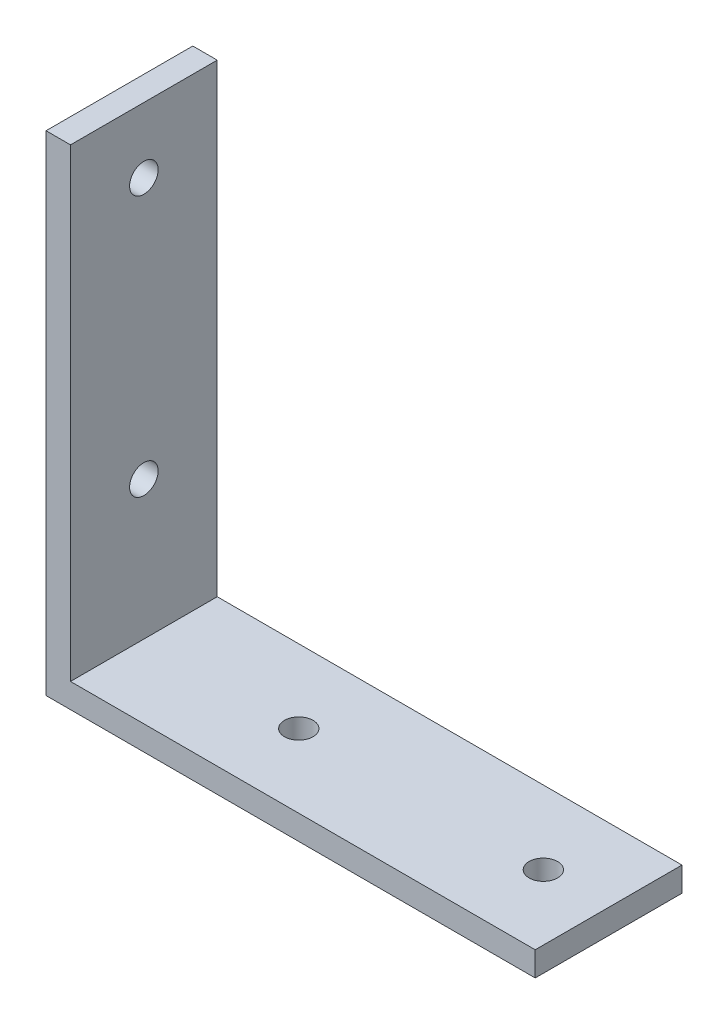
ISO-10303-21;
HEADER;
FILE_DESCRIPTION(('STEP AP214'),'2;1');
FILE_NAME('part.step','',(''),(''),'','','');
FILE_SCHEMA(('AUTOMOTIVE_DESIGN { 1 0 10303 214 1 1 1 1 }'));
ENDSEC;
DATA;
#1=APPLICATION_CONTEXT('core data for automotive mechanical design processes');
#2=APPLICATION_PROTOCOL_DEFINITION('international standard','automotive_design',2000,#1);
#3=PRODUCT_CONTEXT('',#1,'mechanical');
#4=PRODUCT('Part','Part','',(#3));
#5=PRODUCT_RELATED_PRODUCT_CATEGORY('part','',(#4));
#6=PRODUCT_DEFINITION_FORMATION('','',#4);
#7=PRODUCT_DEFINITION_CONTEXT('part definition',#1,'design');
#8=PRODUCT_DEFINITION('design','',#6,#7);
#9=PRODUCT_DEFINITION_SHAPE('','',#8);
#10=(LENGTH_UNIT() NAMED_UNIT(*) SI_UNIT(.MILLI.,.METRE.));
#11=(NAMED_UNIT(*) PLANE_ANGLE_UNIT() SI_UNIT($,.RADIAN.));
#12=(NAMED_UNIT(*) SI_UNIT($,.STERADIAN.) SOLID_ANGLE_UNIT());
#13=UNCERTAINTY_MEASURE_WITH_UNIT(LENGTH_MEASURE(1.E-05),#10,'distance_accuracy_value','');
#14=(GEOMETRIC_REPRESENTATION_CONTEXT(3) GLOBAL_UNCERTAINTY_ASSIGNED_CONTEXT((#13)) GLOBAL_UNIT_ASSIGNED_CONTEXT((#10,
#11,#12)) REPRESENTATION_CONTEXT('',''));
#15=CARTESIAN_POINT('',(0.,0.,0.));
#16=DIRECTION('',(0.,0.,1.));
#17=DIRECTION('',(1.,0.,0.));
#18=AXIS2_PLACEMENT_3D('',#15,#16,#17);
#19=CARTESIAN_POINT('',(0.,60.,18.));
#20=DIRECTION('',(1.,0.,0.));
#21=DIRECTION('',(0.,0.,-1.));
#22=AXIS2_PLACEMENT_3D('',#19,#20,#21);
#23=PLANE('',#22);
#24=CARTESIAN_POINT('',(0.,52.,9.));
#25=DIRECTION('',(1.,0.,0.));
#26=DIRECTION('',(0.,1.,0.));
#27=AXIS2_PLACEMENT_3D('',#24,#25,#26);
#28=CIRCLE('',#27,1.75);
#29=CARTESIAN_POINT('',(0.,53.75,9.));
#30=VERTEX_POINT('',#29);
#31=EDGE_CURVE('E167',#30,#30,#28,.T.);
#32=ORIENTED_EDGE('',*,*,#31,.T.);
#33=EDGE_LOOP('',(#32));
#34=FACE_BOUND('',#33,.T.);
#35=CARTESIAN_POINT('',(0.,20.,9.));
#36=DIRECTION('',(1.,0.,0.));
#37=DIRECTION('',(0.,1.,0.));
#38=AXIS2_PLACEMENT_3D('',#35,#36,#37);
#39=CIRCLE('',#38,1.75);
#40=CARTESIAN_POINT('',(0.,21.75,9.));
#41=VERTEX_POINT('',#40);
#42=EDGE_CURVE('E179',#41,#41,#39,.T.);
#43=ORIENTED_EDGE('',*,*,#42,.T.);
#44=EDGE_LOOP('',(#43));
#45=FACE_BOUND('',#44,.T.);
#46=DIRECTION('',(0.,-1.,0.));
#47=VECTOR('',#46,1.);
#48=CARTESIAN_POINT('',(0.,60.,0.));
#49=LINE('',#48,#47);
#50=CARTESIAN_POINT('',(0.,60.,0.));
#51=VERTEX_POINT('',#50);
#52=CARTESIAN_POINT('',(0.,0.,0.));
#53=VERTEX_POINT('',#52);
#54=EDGE_CURVE('E136',#51,#53,#49,.T.);
#55=ORIENTED_EDGE('',*,*,#54,.T.);
#56=DIRECTION('',(0.,0.,-1.));
#57=VECTOR('',#56,1.);
#58=CARTESIAN_POINT('',(0.,0.,18.));
#59=LINE('',#58,#57);
#60=CARTESIAN_POINT('',(0.,0.,18.));
#61=VERTEX_POINT('',#60);
#62=EDGE_CURVE('E11',#61,#53,#59,.T.);
#63=ORIENTED_EDGE('',*,*,#62,.F.);
#64=DIRECTION('',(0.,-1.,0.));
#65=VECTOR('',#64,1.);
#66=CARTESIAN_POINT('',(0.,60.,18.));
#67=LINE('',#66,#65);
#68=CARTESIAN_POINT('',(0.,60.,18.));
#69=VERTEX_POINT('',#68);
#70=EDGE_CURVE('E153',#69,#61,#67,.T.);
#71=ORIENTED_EDGE('',*,*,#70,.F.);
#72=DIRECTION('',(0.,0.,-1.));
#73=VECTOR('',#72,1.);
#74=CARTESIAN_POINT('',(0.,60.,18.));
#75=LINE('',#74,#73);
#76=EDGE_CURVE('E132',#69,#51,#75,.T.);
#77=ORIENTED_EDGE('',*,*,#76,.T.);
#78=EDGE_LOOP('',(#55,#63,#71,#77));
#79=FACE_BOUND('',#78,.T.);
#80=ADVANCED_FACE('F45',(#34,#45,#79),#23,.F.);
#81=CARTESIAN_POINT('',(0.,0.,18.));
#82=DIRECTION('',(0.,1.,0.));
#83=DIRECTION('',(0.,0.,1.));
#84=AXIS2_PLACEMENT_3D('',#81,#82,#83);
#85=PLANE('',#84);
#86=CARTESIAN_POINT('',(52.,0.,9.00000000000001));
#87=DIRECTION('',(0.,1.,0.));
#88=DIRECTION('',(-1.,0.,0.));
#89=AXIS2_PLACEMENT_3D('',#86,#87,#88);
#90=CIRCLE('',#89,1.75);
#91=CARTESIAN_POINT('',(50.25,0.,9.00000000000001));
#92=VERTEX_POINT('',#91);
#93=EDGE_CURVE('E173',#92,#92,#90,.T.);
#94=ORIENTED_EDGE('',*,*,#93,.T.);
#95=EDGE_LOOP('',(#94));
#96=FACE_BOUND('',#95,.T.);
#97=CARTESIAN_POINT('',(22.,0.,9.00000000000001));
#98=DIRECTION('',(0.,1.,0.));
#99=DIRECTION('',(-1.,0.,0.));
#100=AXIS2_PLACEMENT_3D('',#97,#98,#99);
#101=CIRCLE('',#100,1.75);
#102=CARTESIAN_POINT('',(20.25,0.,9.00000000000001));
#103=VERTEX_POINT('',#102);
#104=EDGE_CURVE('E181',#103,#103,#101,.T.);
#105=ORIENTED_EDGE('',*,*,#104,.T.);
#106=EDGE_LOOP('',(#105));
#107=FACE_BOUND('',#106,.T.);
#108=DIRECTION('',(1.,0.,0.));
#109=VECTOR('',#108,1.);
#110=CARTESIAN_POINT('',(0.,0.,0.));
#111=LINE('',#110,#109);
#112=CARTESIAN_POINT('',(60.,0.,0.));
#113=VERTEX_POINT('',#112);
#114=EDGE_CURVE('E140',#53,#113,#111,.T.);
#115=ORIENTED_EDGE('',*,*,#114,.T.);
#116=DIRECTION('',(0.,0.,-1.));
#117=VECTOR('',#116,1.);
#118=CARTESIAN_POINT('',(60.,0.,18.));
#119=LINE('',#118,#117);
#120=CARTESIAN_POINT('',(60.,0.,18.));
#121=VERTEX_POINT('',#120);
#122=EDGE_CURVE('E55',#121,#113,#119,.T.);
#123=ORIENTED_EDGE('',*,*,#122,.F.);
#124=DIRECTION('',(1.,0.,0.));
#125=VECTOR('',#124,1.);
#126=CARTESIAN_POINT('',(0.,0.,18.));
#127=LINE('',#126,#125);
#128=EDGE_CURVE('E101',#61,#121,#127,.T.);
#129=ORIENTED_EDGE('',*,*,#128,.F.);
#130=ORIENTED_EDGE('',*,*,#62,.T.);
#131=EDGE_LOOP('',(#115,#123,#129,#130));
#132=FACE_BOUND('',#131,.T.);
#133=ADVANCED_FACE('F201',(#96,#107,#132),#85,.F.);
#134=CARTESIAN_POINT('',(60.,0.,18.));
#135=DIRECTION('',(-1.,0.,0.));
#136=DIRECTION('',(0.,0.,1.));
#137=AXIS2_PLACEMENT_3D('',#134,#135,#136);
#138=PLANE('',#137);
#139=DIRECTION('',(0.,1.,0.));
#140=VECTOR('',#139,1.);
#141=CARTESIAN_POINT('',(60.,0.,0.));
#142=LINE('',#141,#140);
#143=CARTESIAN_POINT('',(60.,3.,0.));
#144=VERTEX_POINT('',#143);
#145=EDGE_CURVE('E144',#113,#144,#142,.T.);
#146=ORIENTED_EDGE('',*,*,#145,.T.);
#147=DIRECTION('',(0.,0.,-1.));
#148=VECTOR('',#147,1.);
#149=CARTESIAN_POINT('',(60.,3.,18.));
#150=LINE('',#149,#148);
#151=CARTESIAN_POINT('',(60.,3.,18.));
#152=VERTEX_POINT('',#151);
#153=EDGE_CURVE('E125',#152,#144,#150,.T.);
#154=ORIENTED_EDGE('',*,*,#153,.F.);
#155=DIRECTION('',(0.,1.,0.));
#156=VECTOR('',#155,1.);
#157=CARTESIAN_POINT('',(60.,0.,18.));
#158=LINE('',#157,#156);
#159=EDGE_CURVE('E114',#121,#152,#158,.T.);
#160=ORIENTED_EDGE('',*,*,#159,.F.);
#161=ORIENTED_EDGE('',*,*,#122,.T.);
#162=EDGE_LOOP('',(#146,#154,#160,#161));
#163=FACE_BOUND('',#162,.T.);
#164=ADVANCED_FACE('F204',(#163),#138,.F.);
#165=CARTESIAN_POINT('',(60.,3.,18.));
#166=DIRECTION('',(0.,-1.,0.));
#167=DIRECTION('',(1.,0.,0.));
#168=AXIS2_PLACEMENT_3D('',#165,#166,#167);
#169=PLANE('',#168);
#170=CARTESIAN_POINT('',(52.,3.,9.00000000000001));
#171=DIRECTION('',(0.,-1.,0.));
#172=DIRECTION('',(1.,0.,0.));
#173=AXIS2_PLACEMENT_3D('',#170,#171,#172);
#174=CIRCLE('',#173,1.75);
#175=CARTESIAN_POINT('',(53.75,3.,9.00000000000001));
#176=VERTEX_POINT('',#175);
#177=EDGE_CURVE('E48',#176,#176,#174,.T.);
#178=ORIENTED_EDGE('',*,*,#177,.T.);
#179=EDGE_LOOP('',(#178));
#180=FACE_BOUND('',#179,.T.);
#181=CARTESIAN_POINT('',(22.,2.99999999999999,9.00000000000001));
#182=DIRECTION('',(0.,-1.,0.));
#183=DIRECTION('',(1.,0.,0.));
#184=AXIS2_PLACEMENT_3D('',#181,#182,#183);
#185=CIRCLE('',#184,1.75);
#186=CARTESIAN_POINT('',(23.75,2.99999999999999,9.00000000000001));
#187=VERTEX_POINT('',#186);
#188=EDGE_CURVE('E170',#187,#187,#185,.T.);
#189=ORIENTED_EDGE('',*,*,#188,.T.);
#190=EDGE_LOOP('',(#189));
#191=FACE_BOUND('',#190,.T.);
#192=DIRECTION('',(-1.,0.,0.));
#193=VECTOR('',#192,1.);
#194=CARTESIAN_POINT('',(60.,3.,0.));
#195=LINE('',#194,#193);
#196=CARTESIAN_POINT('',(3.,2.99999999999999,0.));
#197=VERTEX_POINT('',#196);
#198=EDGE_CURVE('E123',#144,#197,#195,.T.);
#199=ORIENTED_EDGE('',*,*,#198,.T.);
#200=DIRECTION('',(0.,0.,-1.));
#201=VECTOR('',#200,1.);
#202=CARTESIAN_POINT('',(3.,2.99999999999999,18.));
#203=LINE('',#202,#201);
#204=CARTESIAN_POINT('',(3.,2.99999999999999,18.));
#205=VERTEX_POINT('',#204);
#206=EDGE_CURVE('E120',#205,#197,#203,.T.);
#207=ORIENTED_EDGE('',*,*,#206,.F.);
#208=DIRECTION('',(-1.,0.,0.));
#209=VECTOR('',#208,1.);
#210=CARTESIAN_POINT('',(60.,3.,18.));
#211=LINE('',#210,#209);
#212=EDGE_CURVE('E108',#152,#205,#211,.T.);
#213=ORIENTED_EDGE('',*,*,#212,.F.);
#214=ORIENTED_EDGE('',*,*,#153,.T.);
#215=EDGE_LOOP('',(#199,#207,#213,#214));
#216=FACE_BOUND('',#215,.T.);
#217=ADVANCED_FACE('F121',(#180,#191,#216),#169,.F.);
#218=CARTESIAN_POINT('',(3.,2.99999999999999,18.));
#219=DIRECTION('',(-1.,0.,0.));
#220=DIRECTION('',(0.,-1.,0.));
#221=AXIS2_PLACEMENT_3D('',#218,#219,#220);
#222=PLANE('',#221);
#223=CARTESIAN_POINT('',(3.,52.,9.));
#224=DIRECTION('',(-1.,0.,0.));
#225=DIRECTION('',(0.,-1.,0.));
#226=AXIS2_PLACEMENT_3D('',#223,#224,#225);
#227=CIRCLE('',#226,1.75);
#228=CARTESIAN_POINT('',(3.,50.25,9.));
#229=VERTEX_POINT('',#228);
#230=EDGE_CURVE('E141',#229,#229,#227,.T.);
#231=ORIENTED_EDGE('',*,*,#230,.T.);
#232=EDGE_LOOP('',(#231));
#233=FACE_BOUND('',#232,.T.);
#234=CARTESIAN_POINT('',(3.,20.,9.));
#235=DIRECTION('',(-1.,0.,0.));
#236=DIRECTION('',(0.,-1.,0.));
#237=AXIS2_PLACEMENT_3D('',#234,#235,#236);
#238=CIRCLE('',#237,1.75);
#239=CARTESIAN_POINT('',(3.,18.25,9.));
#240=VERTEX_POINT('',#239);
#241=EDGE_CURVE('E163',#240,#240,#238,.T.);
#242=ORIENTED_EDGE('',*,*,#241,.T.);
#243=EDGE_LOOP('',(#242));
#244=FACE_BOUND('',#243,.T.);
#245=DIRECTION('',(0.,1.,0.));
#246=VECTOR('',#245,1.);
#247=CARTESIAN_POINT('',(3.,2.99999999999999,0.));
#248=LINE('',#247,#246);
#249=CARTESIAN_POINT('',(3.,60.,0.));
#250=VERTEX_POINT('',#249);
#251=EDGE_CURVE('E87',#197,#250,#248,.T.);
#252=ORIENTED_EDGE('',*,*,#251,.T.);
#253=DIRECTION('',(0.,0.,-1.));
#254=VECTOR('',#253,1.);
#255=CARTESIAN_POINT('',(3.,60.,18.));
#256=LINE('',#255,#254);
#257=CARTESIAN_POINT('',(3.,60.,18.));
#258=VERTEX_POINT('',#257);
#259=EDGE_CURVE('E126',#258,#250,#256,.T.);
#260=ORIENTED_EDGE('',*,*,#259,.F.);
#261=DIRECTION('',(0.,1.,0.));
#262=VECTOR('',#261,1.);
#263=CARTESIAN_POINT('',(3.,2.99999999999999,18.));
#264=LINE('',#263,#262);
#265=EDGE_CURVE('E112',#205,#258,#264,.T.);
#266=ORIENTED_EDGE('',*,*,#265,.F.);
#267=ORIENTED_EDGE('',*,*,#206,.T.);
#268=EDGE_LOOP('',(#252,#260,#266,#267));
#269=FACE_BOUND('',#268,.T.);
#270=ADVANCED_FACE('F128',(#233,#244,#269),#222,.F.);
#271=CARTESIAN_POINT('',(3.,60.,18.));
#272=DIRECTION('',(0.,-1.,0.));
#273=DIRECTION('',(1.,0.,0.));
#274=AXIS2_PLACEMENT_3D('',#271,#272,#273);
#275=PLANE('',#274);
#276=DIRECTION('',(-1.,0.,0.));
#277=VECTOR('',#276,1.);
#278=CARTESIAN_POINT('',(3.,60.,0.));
#279=LINE('',#278,#277);
#280=EDGE_CURVE('E93',#250,#51,#279,.T.);
#281=ORIENTED_EDGE('',*,*,#280,.T.);
#282=ORIENTED_EDGE('',*,*,#76,.F.);
#283=DIRECTION('',(-1.,0.,0.));
#284=VECTOR('',#283,1.);
#285=CARTESIAN_POINT('',(3.,60.,18.));
#286=LINE('',#285,#284);
#287=EDGE_CURVE('E64',#258,#69,#286,.T.);
#288=ORIENTED_EDGE('',*,*,#287,.F.);
#289=ORIENTED_EDGE('',*,*,#259,.T.);
#290=EDGE_LOOP('',(#281,#282,#288,#289));
#291=FACE_BOUND('',#290,.T.);
#292=ADVANCED_FACE('F209',(#291),#275,.F.);
#293=CARTESIAN_POINT('',(0.,0.,18.));
#294=DIRECTION('',(0.,0.,1.));
#295=DIRECTION('',(1.,0.,0.));
#296=AXIS2_PLACEMENT_3D('',#293,#294,#295);
#297=PLANE('',#296);
#298=ORIENTED_EDGE('',*,*,#70,.T.);
#299=ORIENTED_EDGE('',*,*,#128,.T.);
#300=ORIENTED_EDGE('',*,*,#159,.T.);
#301=ORIENTED_EDGE('',*,*,#212,.T.);
#302=ORIENTED_EDGE('',*,*,#265,.T.);
#303=ORIENTED_EDGE('',*,*,#287,.T.);
#304=EDGE_LOOP('',(#298,#299,#300,#301,#302,#303));
#305=FACE_BOUND('',#304,.T.);
#306=ADVANCED_FACE('F110',(#305),#297,.T.);
#307=CARTESIAN_POINT('',(0.,0.,0.));
#308=DIRECTION('',(0.,0.,1.));
#309=DIRECTION('',(1.,0.,0.));
#310=AXIS2_PLACEMENT_3D('',#307,#308,#309);
#311=PLANE('',#310);
#312=ORIENTED_EDGE('',*,*,#54,.F.);
#313=ORIENTED_EDGE('',*,*,#280,.F.);
#314=ORIENTED_EDGE('',*,*,#251,.F.);
#315=ORIENTED_EDGE('',*,*,#198,.F.);
#316=ORIENTED_EDGE('',*,*,#145,.F.);
#317=ORIENTED_EDGE('',*,*,#114,.F.);
#318=EDGE_LOOP('',(#312,#313,#314,#315,#316,#317));
#319=FACE_BOUND('',#318,.T.);
#320=ADVANCED_FACE('F207',(#319),#311,.F.);
#321=CARTESIAN_POINT('',(0.,20.,9.));
#322=DIRECTION('',(1.,0.,0.));
#323=DIRECTION('',(0.,1.,0.));
#324=AXIS2_PLACEMENT_3D('',#321,#322,#323);
#325=CYLINDRICAL_SURFACE('',#324,1.75);
#326=ORIENTED_EDGE('',*,*,#42,.F.);
#327=EDGE_LOOP('',(#326));
#328=FACE_BOUND('',#327,.T.);
#329=ORIENTED_EDGE('',*,*,#241,.F.);
#330=EDGE_LOOP('',(#329));
#331=FACE_BOUND('',#330,.T.);
#332=ADVANCED_FACE('F231',(#328,#331),#325,.F.);
#333=CARTESIAN_POINT('',(0.,52.,9.));
#334=DIRECTION('',(1.,0.,0.));
#335=DIRECTION('',(0.,1.,0.));
#336=AXIS2_PLACEMENT_3D('',#333,#334,#335);
#337=CYLINDRICAL_SURFACE('',#336,1.75);
#338=ORIENTED_EDGE('',*,*,#31,.F.);
#339=EDGE_LOOP('',(#338));
#340=FACE_BOUND('',#339,.T.);
#341=ORIENTED_EDGE('',*,*,#230,.F.);
#342=EDGE_LOOP('',(#341));
#343=FACE_BOUND('',#342,.T.);
#344=ADVANCED_FACE('F234',(#340,#343),#337,.F.);
#345=CARTESIAN_POINT('',(22.,0.,9.00000000000001));
#346=DIRECTION('',(0.,1.,0.));
#347=DIRECTION('',(-1.,0.,0.));
#348=AXIS2_PLACEMENT_3D('',#345,#346,#347);
#349=CYLINDRICAL_SURFACE('',#348,1.75);
#350=ORIENTED_EDGE('',*,*,#104,.F.);
#351=EDGE_LOOP('',(#350));
#352=FACE_BOUND('',#351,.T.);
#353=ORIENTED_EDGE('',*,*,#188,.F.);
#354=EDGE_LOOP('',(#353));
#355=FACE_BOUND('',#354,.T.);
#356=ADVANCED_FACE('F241',(#352,#355),#349,.F.);
#357=CARTESIAN_POINT('',(52.,0.,9.00000000000001));
#358=DIRECTION('',(0.,1.,0.));
#359=DIRECTION('',(-1.,0.,0.));
#360=AXIS2_PLACEMENT_3D('',#357,#358,#359);
#361=CYLINDRICAL_SURFACE('',#360,1.75);
#362=ORIENTED_EDGE('',*,*,#93,.F.);
#363=EDGE_LOOP('',(#362));
#364=FACE_BOUND('',#363,.T.);
#365=ORIENTED_EDGE('',*,*,#177,.F.);
#366=EDGE_LOOP('',(#365));
#367=FACE_BOUND('',#366,.T.);
#368=ADVANCED_FACE('F247',(#364,#367),#361,.F.);
#369=CLOSED_SHELL('',(#80,#133,#164,#217,#270,#292,#306,#320,#332,#344,#356,#368));
#370=MANIFOLD_SOLID_BREP('B2',#369);
#371=ADVANCED_BREP_SHAPE_REPRESENTATION('',(#18,#370),#14);
#372=SHAPE_DEFINITION_REPRESENTATION(#9,#371);
ENDSEC;
END-ISO-10303-21;
